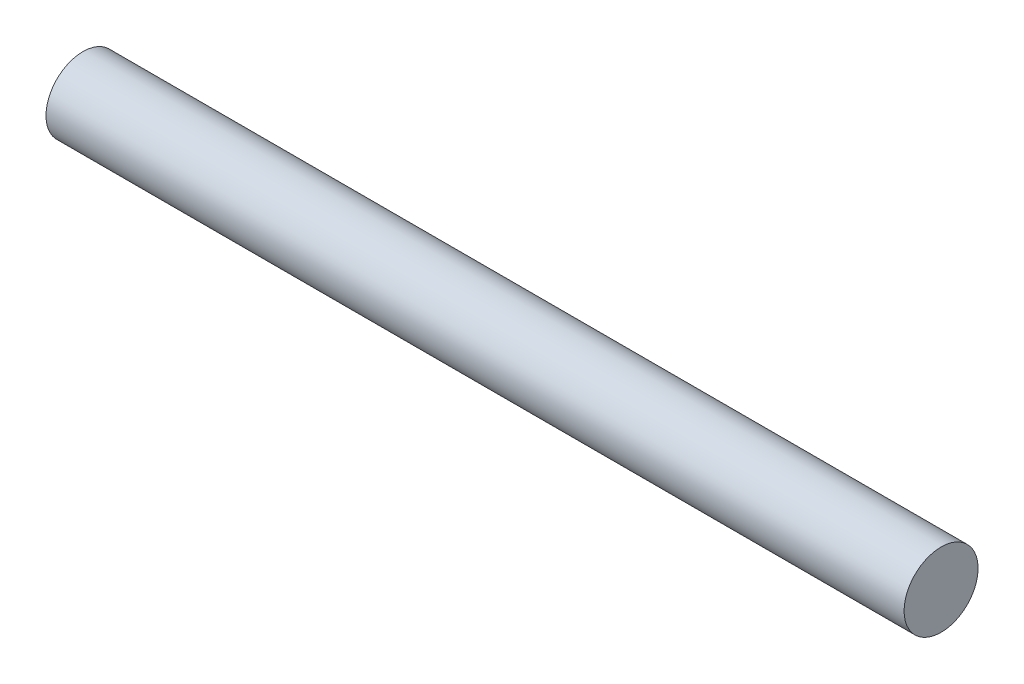
ISO-10303-21;
HEADER;
FILE_DESCRIPTION(('STEP AP214'),'2;1');
FILE_NAME('part.step','',(''),(''),'','','');
FILE_SCHEMA(('AUTOMOTIVE_DESIGN { 1 0 10303 214 1 1 1 1 }'));
ENDSEC;
DATA;
#1=APPLICATION_CONTEXT('core data for automotive mechanical design processes');
#2=APPLICATION_PROTOCOL_DEFINITION('international standard','automotive_design',2000,#1);
#3=PRODUCT_CONTEXT('',#1,'mechanical');
#4=PRODUCT('Part','Part','',(#3));
#5=PRODUCT_RELATED_PRODUCT_CATEGORY('part','',(#4));
#6=PRODUCT_DEFINITION_FORMATION('','',#4);
#7=PRODUCT_DEFINITION_CONTEXT('part definition',#1,'design');
#8=PRODUCT_DEFINITION('design','',#6,#7);
#9=PRODUCT_DEFINITION_SHAPE('','',#8);
#10=(LENGTH_UNIT() NAMED_UNIT(*) SI_UNIT(.MILLI.,.METRE.));
#11=(NAMED_UNIT(*) PLANE_ANGLE_UNIT() SI_UNIT($,.RADIAN.));
#12=(NAMED_UNIT(*) SI_UNIT($,.STERADIAN.) SOLID_ANGLE_UNIT());
#13=UNCERTAINTY_MEASURE_WITH_UNIT(LENGTH_MEASURE(1.E-05),#10,'distance_accuracy_value','');
#14=(GEOMETRIC_REPRESENTATION_CONTEXT(3) GLOBAL_UNCERTAINTY_ASSIGNED_CONTEXT((#13)) GLOBAL_UNIT_ASSIGNED_CONTEXT((#10,
#11,#12)) REPRESENTATION_CONTEXT('',''));
#15=CARTESIAN_POINT('',(0.,0.,0.));
#16=DIRECTION('',(0.,0.,1.));
#17=DIRECTION('',(1.,0.,0.));
#18=AXIS2_PLACEMENT_3D('',#15,#16,#17);
#19=CARTESIAN_POINT('',(58.,0.,0.));
#20=DIRECTION('',(-1.,0.,0.));
#21=DIRECTION('',(0.,0.,1.));
#22=AXIS2_PLACEMENT_3D('',#19,#20,#21);
#23=CYLINDRICAL_SURFACE('',#22,2.5);
#24=CARTESIAN_POINT('',(58.,0.,0.));
#25=DIRECTION('',(1.,0.,0.));
#26=DIRECTION('',(0.,0.,-1.));
#27=AXIS2_PLACEMENT_3D('',#24,#25,#26);
#28=CIRCLE('',#27,2.5);
#29=CARTESIAN_POINT('',(58.,0.,2.5));
#30=VERTEX_POINT('',#29);
#31=EDGE_CURVE('E10',#30,#30,#28,.T.);
#32=CARTESIAN_POINT('',(0.,0.,0.));
#33=DIRECTION('',(1.,0.,0.));
#34=DIRECTION('',(0.,0.,-1.));
#35=AXIS2_PLACEMENT_3D('',#32,#33,#34);
#36=CIRCLE('',#35,2.5);
#37=CARTESIAN_POINT('',(0.,0.,2.5));
#38=VERTEX_POINT('',#37);
#39=EDGE_CURVE('E44',#38,#38,#36,.T.);
#40=CARTESIAN_POINT('',(58.,0.,2.5));
#41=CARTESIAN_POINT('',(57.3958333333333,0.,2.5));
#42=CARTESIAN_POINT('',(56.7916666666667,0.,2.5));
#43=CARTESIAN_POINT('',(55.5833333333333,0.,2.5));
#44=CARTESIAN_POINT('',(54.9791666666667,0.,2.5));
#45=CARTESIAN_POINT('',(53.7708333333333,0.,2.5));
#46=CARTESIAN_POINT('',(53.1666666666667,0.,2.5));
#47=CARTESIAN_POINT('',(51.9583333333333,0.,2.5));
#48=CARTESIAN_POINT('',(51.3541666666667,0.,2.5));
#49=CARTESIAN_POINT('',(50.1458333333333,0.,2.5));
#50=CARTESIAN_POINT('',(49.5416666666667,0.,2.5));
#51=CARTESIAN_POINT('',(48.3333333333333,0.,2.5));
#52=CARTESIAN_POINT('',(47.7291666666667,0.,2.5));
#53=CARTESIAN_POINT('',(46.5208333333333,0.,2.5));
#54=CARTESIAN_POINT('',(45.9166666666667,0.,2.5));
#55=CARTESIAN_POINT('',(44.7083333333333,0.,2.5));
#56=CARTESIAN_POINT('',(44.1041666666667,0.,2.5));
#57=CARTESIAN_POINT('',(42.8958333333333,0.,2.5));
#58=CARTESIAN_POINT('',(42.2916666666667,0.,2.5));
#59=CARTESIAN_POINT('',(41.0833333333333,0.,2.5));
#60=CARTESIAN_POINT('',(40.4791666666667,0.,2.5));
#61=CARTESIAN_POINT('',(39.2708333333333,0.,2.5));
#62=CARTESIAN_POINT('',(38.6666666666667,0.,2.5));
#63=CARTESIAN_POINT('',(37.4583333333333,0.,2.5));
#64=CARTESIAN_POINT('',(36.8541666666667,0.,2.5));
#65=CARTESIAN_POINT('',(35.6458333333333,0.,2.5));
#66=CARTESIAN_POINT('',(35.0416666666667,0.,2.5));
#67=CARTESIAN_POINT('',(33.8333333333333,0.,2.5));
#68=CARTESIAN_POINT('',(33.2291666666667,0.,2.5));
#69=CARTESIAN_POINT('',(32.0208333333333,0.,2.5));
#70=CARTESIAN_POINT('',(31.4166666666667,0.,2.5));
#71=CARTESIAN_POINT('',(30.2083333333333,0.,2.5));
#72=CARTESIAN_POINT('',(29.6041666666667,0.,2.5));
#73=CARTESIAN_POINT('',(28.3958333333333,0.,2.5));
#74=CARTESIAN_POINT('',(27.7916666666667,0.,2.5));
#75=CARTESIAN_POINT('',(26.5833333333333,0.,2.5));
#76=CARTESIAN_POINT('',(25.9791666666667,0.,2.5));
#77=CARTESIAN_POINT('',(24.7708333333333,0.,2.5));
#78=CARTESIAN_POINT('',(24.1666666666667,0.,2.5));
#79=CARTESIAN_POINT('',(22.9583333333333,0.,2.5));
#80=CARTESIAN_POINT('',(22.3541666666667,0.,2.5));
#81=CARTESIAN_POINT('',(21.1458333333333,0.,2.5));
#82=CARTESIAN_POINT('',(20.5416666666667,0.,2.5));
#83=CARTESIAN_POINT('',(19.3333333333333,0.,2.5));
#84=CARTESIAN_POINT('',(18.7291666666667,0.,2.5));
#85=CARTESIAN_POINT('',(17.5208333333333,0.,2.5));
#86=CARTESIAN_POINT('',(16.9166666666667,0.,2.5));
#87=CARTESIAN_POINT('',(15.7083333333333,0.,2.5));
#88=CARTESIAN_POINT('',(15.1041666666667,0.,2.5));
#89=CARTESIAN_POINT('',(13.8958333333333,0.,2.5));
#90=CARTESIAN_POINT('',(13.2916666666667,0.,2.5));
#91=CARTESIAN_POINT('',(12.0833333333333,0.,2.5));
#92=CARTESIAN_POINT('',(11.4791666666667,0.,2.5));
#93=CARTESIAN_POINT('',(10.2708333333333,0.,2.5));
#94=CARTESIAN_POINT('',(9.66666666666667,0.,2.5));
#95=CARTESIAN_POINT('',(8.45833333333333,0.,2.5));
#96=CARTESIAN_POINT('',(7.85416666666667,0.,2.5));
#97=CARTESIAN_POINT('',(6.64583333333333,0.,2.5));
#98=CARTESIAN_POINT('',(6.04166666666667,0.,2.5));
#99=CARTESIAN_POINT('',(4.83333333333333,0.,2.5));
#100=CARTESIAN_POINT('',(4.22916666666667,0.,2.5));
#101=CARTESIAN_POINT('',(3.02083333333334,0.,2.5));
#102=CARTESIAN_POINT('',(2.41666666666667,0.,2.5));
#103=CARTESIAN_POINT('',(1.20833333333333,0.,2.5));
#104=CARTESIAN_POINT('',(0.604166666666666,0.,2.5));
#105=CARTESIAN_POINT('',(0.,0.,2.5));
#106=B_SPLINE_CURVE_WITH_KNOTS('',3,(#40,#41,#42,#43,#44,#45,#46,#47,#48,#49,#50,#51,#52,#53,
#54,#55,#56,#57,#58,#59,#60,#61,#62,#63,#64,#65,#66,#67,#68,#69,#70,#71,#72,#73,#74,#75,#76,#77,
#78,#79,#80,#81,#82,#83,#84,#85,#86,#87,#88,#89,#90,#91,#92,#93,#94,#95,#96,#97,#98,#99,#100,
#101,#102,#103,#104,#105),.UNSPECIFIED.,.F.,.F.,(4,2,2,2,2,2,2,2,2,2,2,2,2,2,2,2,2,2,2,2,2,2,2,
2,2,2,2,2,2,2,2,2,4),(0.,1.81249999999999,3.625,5.4375,7.24999999999999,9.06249999999999,10.875,
12.6875,14.5,16.3125,18.125,19.9375,21.75,23.5625,25.375,27.1875,29.,30.8125,32.625,34.4375,
36.25,38.0625,39.875,41.6875,43.5,45.3125,47.125,48.9375,50.75,52.5625,54.375,56.1875,58.),.UNSPECIFIED.);
#107=EDGE_CURVE('BSEAM41',#30,#38,#106,.T.);
#108=ORIENTED_EDGE('',*,*,#31,.F.);
#109=ORIENTED_EDGE('',*,*,#39,.T.);
#110=ORIENTED_EDGE('',*,*,#107,.T.);
#111=ORIENTED_EDGE('',*,*,#107,.F.);
#112=EDGE_LOOP('',(#108,#110,#109,#111));
#113=FACE_BOUND('',#112,.T.);
#114=ADVANCED_FACE('F41',(#113),#23,.T.);
#115=CARTESIAN_POINT('',(58.,0.,0.));
#116=DIRECTION('',(1.,0.,0.));
#117=DIRECTION('',(0.,0.,-1.));
#118=AXIS2_PLACEMENT_3D('',#115,#116,#117);
#119=PLANE('',#118);
#120=ORIENTED_EDGE('',*,*,#31,.T.);
#121=EDGE_LOOP('',(#120));
#122=FACE_BOUND('',#121,.T.);
#123=ADVANCED_FACE('F58',(#122),#119,.T.);
#124=CARTESIAN_POINT('',(0.,0.,0.));
#125=DIRECTION('',(1.,0.,0.));
#126=DIRECTION('',(0.,0.,-1.));
#127=AXIS2_PLACEMENT_3D('',#124,#125,#126);
#128=PLANE('',#127);
#129=ORIENTED_EDGE('',*,*,#39,.F.);
#130=EDGE_LOOP('',(#129));
#131=FACE_BOUND('',#130,.T.);
#132=ADVANCED_FACE('F56',(#131),#128,.F.);
#133=CLOSED_SHELL('',(#114,#123,#132));
#134=MANIFOLD_SOLID_BREP('B2',#133);
#135=ADVANCED_BREP_SHAPE_REPRESENTATION('',(#18,#134),#14);
#136=SHAPE_DEFINITION_REPRESENTATION(#9,#135);
ENDSEC;
END-ISO-10303-21;
